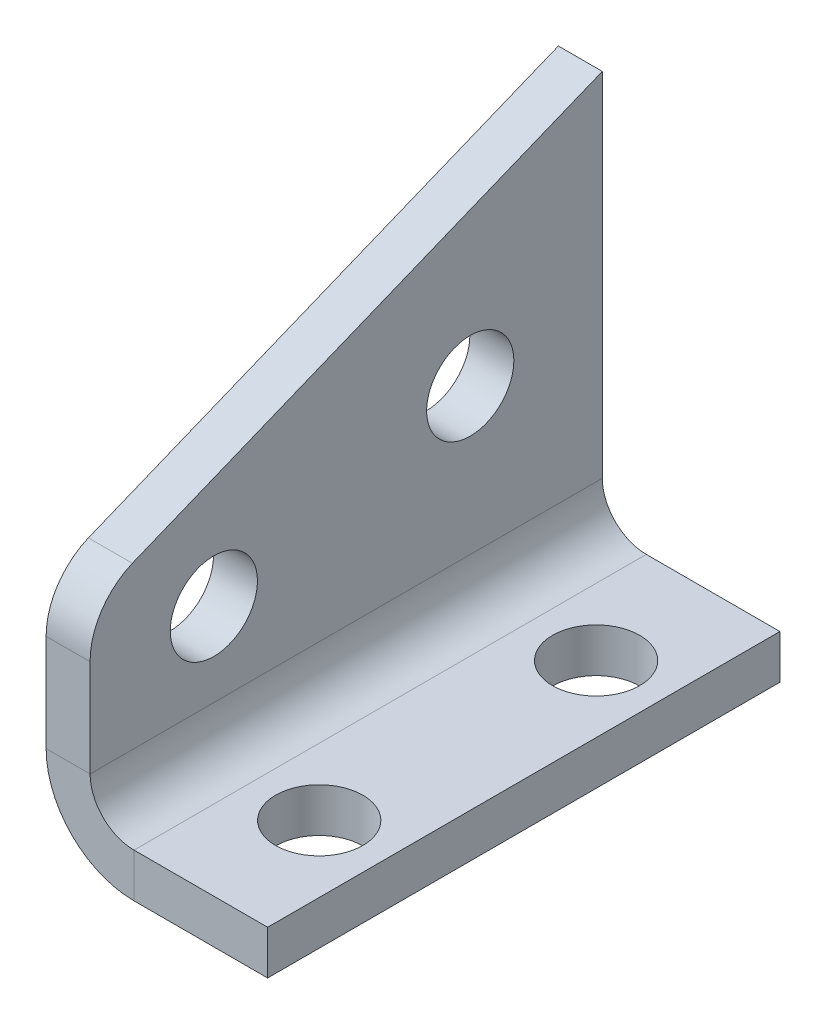
ISO-10303-21;
HEADER;
FILE_DESCRIPTION(('STEP AP214'),'2;1');
FILE_NAME('part.step','',(''),(''),'','','');
FILE_SCHEMA(('AUTOMOTIVE_DESIGN { 1 0 10303 214 1 1 1 1 }'));
ENDSEC;
DATA;
#1=APPLICATION_CONTEXT('core data for automotive mechanical design processes');
#2=APPLICATION_PROTOCOL_DEFINITION('international standard','automotive_design',2000,#1);
#3=PRODUCT_CONTEXT('',#1,'mechanical');
#4=PRODUCT('Part','Part','',(#3));
#5=PRODUCT_RELATED_PRODUCT_CATEGORY('part','',(#4));
#6=PRODUCT_DEFINITION_FORMATION('','',#4);
#7=PRODUCT_DEFINITION_CONTEXT('part definition',#1,'design');
#8=PRODUCT_DEFINITION('design','',#6,#7);
#9=PRODUCT_DEFINITION_SHAPE('','',#8);
#10=(LENGTH_UNIT() NAMED_UNIT(*) SI_UNIT(.MILLI.,.METRE.));
#11=(NAMED_UNIT(*) PLANE_ANGLE_UNIT() SI_UNIT($,.RADIAN.));
#12=(NAMED_UNIT(*) SI_UNIT($,.STERADIAN.) SOLID_ANGLE_UNIT());
#13=UNCERTAINTY_MEASURE_WITH_UNIT(LENGTH_MEASURE(1.E-05),#10,'distance_accuracy_value','');
#14=(GEOMETRIC_REPRESENTATION_CONTEXT(3) GLOBAL_UNCERTAINTY_ASSIGNED_CONTEXT((#13)) GLOBAL_UNIT_ASSIGNED_CONTEXT((#10,
#11,#12)) REPRESENTATION_CONTEXT('',''));
#15=CARTESIAN_POINT('',(0.,0.,0.));
#16=DIRECTION('',(0.,0.,1.));
#17=DIRECTION('',(1.,0.,0.));
#18=AXIS2_PLACEMENT_3D('',#15,#16,#17);
#19=CARTESIAN_POINT('',(-3.175,40.2912185861881,-48.5510647852261));
#20=DIRECTION('',(0.,0.,-1.));
#21=DIRECTION('',(-1.,0.,0.));
#22=AXIS2_PLACEMENT_3D('',#19,#20,#21);
#23=PLANE('',#22);
#24=DIRECTION('',(0.,1.,0.));
#25=VECTOR('',#24,1.);
#26=CARTESIAN_POINT('',(0.,40.2912185861881,-48.5510647852261));
#27=LINE('',#26,#25);
#28=CARTESIAN_POINT('',(0.,46.6412185861881,-48.5510647852261));
#29=VERTEX_POINT('',#28);
#30=CARTESIAN_POINT('',(0.,72.0930667513475,-48.5510647852261));
#31=VERTEX_POINT('',#30);
#32=EDGE_CURVE('E263',#29,#31,#27,.T.);
#33=ORIENTED_EDGE('',*,*,#32,.F.);
#34=DIRECTION('',(-1.,0.,0.));
#35=VECTOR('',#34,1.);
#36=CARTESIAN_POINT('',(0.,46.6412185861881,-48.5510647852261));
#37=LINE('',#36,#35);
#38=CARTESIAN_POINT('',(-3.175,46.6412185861881,-48.5510647852261));
#39=VERTEX_POINT('',#38);
#40=EDGE_CURVE('E211',#29,#39,#37,.T.);
#41=ORIENTED_EDGE('',*,*,#40,.T.);
#42=DIRECTION('',(0.,1.,0.));
#43=VECTOR('',#42,1.);
#44=CARTESIAN_POINT('',(-3.175,40.2912185861881,-48.5510647852261));
#45=LINE('',#44,#43);
#46=CARTESIAN_POINT('',(-3.175,72.0930667513475,-48.5510647852261));
#47=VERTEX_POINT('',#46);
#48=EDGE_CURVE('E113',#39,#47,#45,.T.);
#49=ORIENTED_EDGE('',*,*,#48,.T.);
#50=DIRECTION('',(1.,0.,0.));
#51=VECTOR('',#50,1.);
#52=CARTESIAN_POINT('',(-3.175,72.0930667513475,-48.5510647852261));
#53=LINE('',#52,#51);
#54=EDGE_CURVE('E71',#47,#31,#53,.T.);
#55=ORIENTED_EDGE('',*,*,#54,.T.);
#56=EDGE_LOOP('',(#33,#41,#49,#55));
#57=FACE_BOUND('',#56,.T.);
#58=ADVANCED_FACE('F67',(#57),#23,.T.);
#59=CARTESIAN_POINT('',(-3.175,53.6927819865224,-16.5509889828002));
#60=DIRECTION('',(1.,0.,0.));
#61=DIRECTION('',(0.,0.,-1.));
#62=AXIS2_PLACEMENT_3D('',#59,#60,#61);
#63=PLANE('',#62);
#64=CARTESIAN_POINT('',(-3.175,57.1947735785803,-39.0112205884761));
#65=DIRECTION('',(1.,0.,0.));
#66=DIRECTION('',(0.,0.,-1.));
#67=AXIS2_PLACEMENT_3D('',#64,#65,#66);
#68=CIRCLE('',#67,3.15);
#69=CARTESIAN_POINT('',(-3.175,57.1947735785803,-42.1612205884761));
#70=VERTEX_POINT('',#69);
#71=EDGE_CURVE('E240',#70,#70,#68,.T.);
#72=ORIENTED_EDGE('',*,*,#71,.T.);
#73=EDGE_LOOP('',(#72));
#74=FACE_BOUND('',#73,.T.);
#75=CARTESIAN_POINT('',(-3.175,52.6725231012808,-20.4902032658352));
#76=DIRECTION('',(1.,0.,0.));
#77=DIRECTION('',(0.,0.,-1.));
#78=AXIS2_PLACEMENT_3D('',#75,#76,#77);
#79=CIRCLE('',#78,3.15);
#80=CARTESIAN_POINT('',(-3.175,52.6725231012808,-23.6402032658352));
#81=VERTEX_POINT('',#80);
#82=EDGE_CURVE('E232',#81,#81,#79,.T.);
#83=ORIENTED_EDGE('',*,*,#82,.T.);
#84=EDGE_LOOP('',(#83));
#85=FACE_BOUND('',#84,.T.);
#86=DIRECTION('',(0.,0.,-1.));
#87=VECTOR('',#86,1.);
#88=CARTESIAN_POINT('',(-3.175,46.6412185861881,-48.5510647852261));
#89=LINE('',#88,#87);
#90=CARTESIAN_POINT('',(-3.175,46.6412185861881,-11.5510647852261));
#91=VERTEX_POINT('',#90);
#92=EDGE_CURVE('E203',#39,#91,#89,.F.);
#93=ORIENTED_EDGE('',*,*,#92,.T.);
#94=DIRECTION('',(0.,-1.,0.));
#95=VECTOR('',#94,1.);
#96=CARTESIAN_POINT('',(-3.175,53.6652498505171,-11.5510647852261));
#97=LINE('',#96,#95);
#98=CARTESIAN_POINT('',(-3.175,53.6652498505171,-11.5510647852261));
#99=VERTEX_POINT('',#98);
#100=EDGE_CURVE('E248',#99,#91,#97,.T.);
#101=ORIENTED_EDGE('',*,*,#100,.F.);
#102=CARTESIAN_POINT('',(-3.175,53.6927819865224,-16.5509889828002));
#103=DIRECTION('',(1.,0.,0.));
#104=DIRECTION('',(0.,0.,-1.));
#105=AXIS2_PLACEMENT_3D('',#102,#103,#104);
#106=CIRCLE('',#105,5.);
#107=CARTESIAN_POINT('',(-3.175,58.2975596939057,-14.6026506483251));
#108=VERTEX_POINT('',#107);
#109=EDGE_CURVE('E258',#108,#99,#106,.T.);
#110=ORIENTED_EDGE('',*,*,#109,.F.);
#111=DIRECTION('',(0.,-0.376469891536026,0.926428853591496));
#112=VECTOR('',#111,1.);
#113=CARTESIAN_POINT('',(-3.175,72.0930667513475,-48.5510647852261));
#114=LINE('',#113,#112);
#115=EDGE_CURVE('E254',#47,#108,#114,.T.);
#116=ORIENTED_EDGE('',*,*,#115,.F.);
#117=ORIENTED_EDGE('',*,*,#48,.F.);
#118=EDGE_LOOP('',(#93,#101,#110,#116,#117));
#119=FACE_BOUND('',#118,.T.);
#120=ADVANCED_FACE('F284',(#74,#85,#119),#63,.F.);
#121=CARTESIAN_POINT('',(0.,53.6927819865224,-16.5509889828002));
#122=DIRECTION('',(1.,0.,0.));
#123=DIRECTION('',(0.,0.,-1.));
#124=AXIS2_PLACEMENT_3D('',#121,#122,#123);
#125=PLANE('',#124);
#126=CARTESIAN_POINT('',(0.,52.6725231012808,-20.4902032658352));
#127=DIRECTION('',(1.,0.,0.));
#128=DIRECTION('',(0.,0.,-1.));
#129=AXIS2_PLACEMENT_3D('',#126,#127,#128);
#130=CIRCLE('',#129,3.15);
#131=CARTESIAN_POINT('',(0.,52.6725231012808,-23.6402032658352));
#132=VERTEX_POINT('',#131);
#133=EDGE_CURVE('E229',#132,#132,#130,.T.);
#134=ORIENTED_EDGE('',*,*,#133,.F.);
#135=EDGE_LOOP('',(#134));
#136=FACE_BOUND('',#135,.T.);
#137=CARTESIAN_POINT('',(0.,57.1947735785803,-39.0112205884761));
#138=DIRECTION('',(1.,0.,0.));
#139=DIRECTION('',(0.,0.,-1.));
#140=AXIS2_PLACEMENT_3D('',#137,#138,#139);
#141=CIRCLE('',#140,3.15);
#142=CARTESIAN_POINT('',(0.,57.1947735785803,-42.1612205884761));
#143=VERTEX_POINT('',#142);
#144=EDGE_CURVE('E236',#143,#143,#141,.T.);
#145=ORIENTED_EDGE('',*,*,#144,.F.);
#146=EDGE_LOOP('',(#145));
#147=FACE_BOUND('',#146,.T.);
#148=DIRECTION('',(0.,-1.,0.));
#149=VECTOR('',#148,1.);
#150=CARTESIAN_POINT('',(0.,53.6652498505171,-11.5510647852261));
#151=LINE('',#150,#149);
#152=CARTESIAN_POINT('',(0.,53.6652498505171,-11.5510647852261));
#153=VERTEX_POINT('',#152);
#154=CARTESIAN_POINT('',(0.,46.6412185861881,-11.5510647852261));
#155=VERTEX_POINT('',#154);
#156=EDGE_CURVE('E244',#153,#155,#151,.T.);
#157=ORIENTED_EDGE('',*,*,#156,.T.);
#158=DIRECTION('',(0.,0.,-1.));
#159=VECTOR('',#158,1.);
#160=CARTESIAN_POINT('',(0.,46.6412185861881,-48.5510647852261));
#161=LINE('',#160,#159);
#162=EDGE_CURVE('E85',#29,#155,#161,.F.);
#163=ORIENTED_EDGE('',*,*,#162,.F.);
#164=ORIENTED_EDGE('',*,*,#32,.T.);
#165=DIRECTION('',(0.,-0.376469891536026,0.926428853591496));
#166=VECTOR('',#165,1.);
#167=CARTESIAN_POINT('',(0.,72.0930667513475,-48.5510647852261));
#168=LINE('',#167,#166);
#169=CARTESIAN_POINT('',(0.,58.2975596939057,-14.6026506483251));
#170=VERTEX_POINT('',#169);
#171=EDGE_CURVE('E266',#31,#170,#168,.T.);
#172=ORIENTED_EDGE('',*,*,#171,.T.);
#173=CARTESIAN_POINT('',(0.,53.6927819865224,-16.5509889828002));
#174=DIRECTION('',(1.,0.,0.));
#175=DIRECTION('',(0.,0.,-1.));
#176=AXIS2_PLACEMENT_3D('',#173,#174,#175);
#177=CIRCLE('',#176,5.);
#178=EDGE_CURVE('E251',#170,#153,#177,.T.);
#179=ORIENTED_EDGE('',*,*,#178,.T.);
#180=EDGE_LOOP('',(#157,#163,#164,#172,#179));
#181=FACE_BOUND('',#180,.T.);
#182=ADVANCED_FACE('F280',(#136,#147,#181),#125,.T.);
#183=CARTESIAN_POINT('',(-3.175,53.6652498505171,-11.5510647852261));
#184=DIRECTION('',(0.,0.,1.));
#185=DIRECTION('',(0.,-1.,0.));
#186=AXIS2_PLACEMENT_3D('',#183,#184,#185);
#187=PLANE('',#186);
#188=DIRECTION('',(-1.,0.,0.));
#189=VECTOR('',#188,1.);
#190=CARTESIAN_POINT('',(0.,46.6412185861881,-11.5510647852261));
#191=LINE('',#190,#189);
#192=EDGE_CURVE('E225',#155,#91,#191,.T.);
#193=ORIENTED_EDGE('',*,*,#192,.F.);
#194=ORIENTED_EDGE('',*,*,#156,.F.);
#195=DIRECTION('',(1.,0.,0.));
#196=VECTOR('',#195,1.);
#197=CARTESIAN_POINT('',(-3.175,53.6652498505171,-11.5510647852261));
#198=LINE('',#197,#196);
#199=EDGE_CURVE('E13',#99,#153,#198,.T.);
#200=ORIENTED_EDGE('',*,*,#199,.F.);
#201=ORIENTED_EDGE('',*,*,#100,.T.);
#202=EDGE_LOOP('',(#193,#194,#200,#201));
#203=FACE_BOUND('',#202,.T.);
#204=ADVANCED_FACE('F69',(#203),#187,.T.);
#205=CARTESIAN_POINT('',(-3.175,53.6927819865224,-16.5509889828002));
#206=DIRECTION('',(1.,0.,0.));
#207=DIRECTION('',(0.,0.,-1.));
#208=AXIS2_PLACEMENT_3D('',#205,#206,#207);
#209=CYLINDRICAL_SURFACE('',#208,5.);
#210=ORIENTED_EDGE('',*,*,#178,.F.);
#211=DIRECTION('',(1.,0.,0.));
#212=VECTOR('',#211,1.);
#213=CARTESIAN_POINT('',(-3.175,58.2975596939057,-14.6026506483251));
#214=LINE('',#213,#212);
#215=EDGE_CURVE('E77',#108,#170,#214,.T.);
#216=ORIENTED_EDGE('',*,*,#215,.F.);
#217=ORIENTED_EDGE('',*,*,#109,.T.);
#218=ORIENTED_EDGE('',*,*,#199,.T.);
#219=EDGE_LOOP('',(#210,#216,#217,#218));
#220=FACE_BOUND('',#219,.T.);
#221=ADVANCED_FACE('F281',(#220),#209,.T.);
#222=CARTESIAN_POINT('',(-3.175,72.0930667513475,-48.5510647852261));
#223=DIRECTION('',(0.,0.926428853591496,0.376469891536026));
#224=DIRECTION('',(0.,-0.376469891536026,0.926428853591496));
#225=AXIS2_PLACEMENT_3D('',#222,#223,#224);
#226=PLANE('',#225);
#227=ORIENTED_EDGE('',*,*,#171,.F.);
#228=ORIENTED_EDGE('',*,*,#54,.F.);
#229=ORIENTED_EDGE('',*,*,#115,.T.);
#230=ORIENTED_EDGE('',*,*,#215,.T.);
#231=EDGE_LOOP('',(#227,#228,#229,#230));
#232=FACE_BOUND('',#231,.T.);
#233=ADVANCED_FACE('F279',(#232),#226,.T.);
#234=CARTESIAN_POINT('',(-3.175,57.1947735785803,-39.0112205884761));
#235=DIRECTION('',(1.,0.,0.));
#236=DIRECTION('',(0.,0.,-1.));
#237=AXIS2_PLACEMENT_3D('',#234,#235,#236);
#238=CYLINDRICAL_SURFACE('',#237,3.15);
#239=ORIENTED_EDGE('',*,*,#71,.F.);
#240=EDGE_LOOP('',(#239));
#241=FACE_BOUND('',#240,.T.);
#242=ORIENTED_EDGE('',*,*,#144,.T.);
#243=EDGE_LOOP('',(#242));
#244=FACE_BOUND('',#243,.T.);
#245=ADVANCED_FACE('F345',(#241,#244),#238,.F.);
#246=CARTESIAN_POINT('',(-3.175,52.6725231012808,-20.4902032658352));
#247=DIRECTION('',(1.,0.,0.));
#248=DIRECTION('',(0.,0.,-1.));
#249=AXIS2_PLACEMENT_3D('',#246,#247,#248);
#250=CYLINDRICAL_SURFACE('',#249,3.15);
#251=ORIENTED_EDGE('',*,*,#82,.F.);
#252=EDGE_LOOP('',(#251));
#253=FACE_BOUND('',#252,.T.);
#254=ORIENTED_EDGE('',*,*,#133,.T.);
#255=EDGE_LOOP('',(#254));
#256=FACE_BOUND('',#255,.T.);
#257=ADVANCED_FACE('F334',(#253,#256),#250,.F.);
#258=CARTESIAN_POINT('',(3.175,46.6412185861881,-11.5510647852261));
#259=DIRECTION('',(0.,0.,1.));
#260=DIRECTION('',(1.,0.,0.));
#261=AXIS2_PLACEMENT_3D('',#258,#259,#260);
#262=PLANE('',#261);
#263=DIRECTION('',(0.,1.,0.));
#264=VECTOR('',#263,1.);
#265=CARTESIAN_POINT('',(3.17499999999998,40.2912185861881,-11.5510647852261));
#266=LINE('',#265,#264);
#267=CARTESIAN_POINT('',(3.17499999999999,43.4662185861881,-11.5510647852261));
#268=VERTEX_POINT('',#267);
#269=CARTESIAN_POINT('',(3.17499999999998,40.2912185861881,-11.5510647852261));
#270=VERTEX_POINT('',#269);
#271=EDGE_CURVE('E175',#268,#270,#266,.F.);
#272=ORIENTED_EDGE('',*,*,#271,.F.);
#273=CARTESIAN_POINT('',(3.175,46.6412185861881,-11.5510647852261));
#274=DIRECTION('',(0.,0.,-1.));
#275=DIRECTION('',(-1.,0.,0.));
#276=AXIS2_PLACEMENT_3D('',#273,#274,#275);
#277=CIRCLE('',#276,3.175);
#278=EDGE_CURVE('E215',#155,#268,#277,.F.);
#279=ORIENTED_EDGE('',*,*,#278,.F.);
#280=ORIENTED_EDGE('',*,*,#192,.T.);
#281=CARTESIAN_POINT('',(3.175,46.6412185861881,-11.5510647852261));
#282=DIRECTION('',(0.,0.,-1.));
#283=DIRECTION('',(-1.,0.,0.));
#284=AXIS2_PLACEMENT_3D('',#281,#282,#283);
#285=CIRCLE('',#284,6.35);
#286=EDGE_CURVE('E206',#91,#270,#285,.F.);
#287=ORIENTED_EDGE('',*,*,#286,.T.);
#288=EDGE_LOOP('',(#272,#279,#280,#287));
#289=FACE_BOUND('',#288,.T.);
#290=ADVANCED_FACE('F289',(#289),#262,.T.);
#291=CARTESIAN_POINT('',(3.175,46.6412185861881,-48.5510647852261));
#292=DIRECTION('',(0.,0.,1.));
#293=DIRECTION('',(1.,0.,0.));
#294=AXIS2_PLACEMENT_3D('',#291,#292,#293);
#295=PLANE('',#294);
#296=CARTESIAN_POINT('',(3.175,46.6412185861881,-48.5510647852261));
#297=DIRECTION('',(0.,0.,-1.));
#298=DIRECTION('',(-1.,0.,0.));
#299=AXIS2_PLACEMENT_3D('',#296,#297,#298);
#300=CIRCLE('',#299,3.175);
#301=CARTESIAN_POINT('',(3.17499999999999,43.4662185861881,-48.5510647852261));
#302=VERTEX_POINT('',#301);
#303=EDGE_CURVE('E221',#302,#29,#300,.T.);
#304=ORIENTED_EDGE('',*,*,#303,.F.);
#305=DIRECTION('',(0.,1.,0.));
#306=VECTOR('',#305,1.);
#307=CARTESIAN_POINT('',(3.17499999999999,43.466218586188,-48.5510647852261));
#308=LINE('',#307,#306);
#309=CARTESIAN_POINT('',(3.17499999999998,40.2912185861881,-48.5510647852261));
#310=VERTEX_POINT('',#309);
#311=EDGE_CURVE('E193',#302,#310,#308,.F.);
#312=ORIENTED_EDGE('',*,*,#311,.T.);
#313=CARTESIAN_POINT('',(3.175,46.6412185861881,-48.5510647852261));
#314=DIRECTION('',(0.,0.,-1.));
#315=DIRECTION('',(-1.,0.,0.));
#316=AXIS2_PLACEMENT_3D('',#313,#314,#315);
#317=CIRCLE('',#316,6.35);
#318=EDGE_CURVE('E207',#310,#39,#317,.T.);
#319=ORIENTED_EDGE('',*,*,#318,.T.);
#320=ORIENTED_EDGE('',*,*,#40,.F.);
#321=EDGE_LOOP('',(#304,#312,#319,#320));
#322=FACE_BOUND('',#321,.T.);
#323=ADVANCED_FACE('F327',(#322),#295,.F.);
#324=CARTESIAN_POINT('',(3.175,46.6412185861881,-48.5510647852261));
#325=DIRECTION('',(0.,0.,-1.));
#326=DIRECTION('',(0.,-1.,0.));
#327=AXIS2_PLACEMENT_3D('',#324,#325,#326);
#328=CYLINDRICAL_SURFACE('',#327,6.35);
#329=ORIENTED_EDGE('',*,*,#92,.F.);
#330=ORIENTED_EDGE('',*,*,#318,.F.);
#331=DIRECTION('',(0.,0.,-1.));
#332=VECTOR('',#331,1.);
#333=CARTESIAN_POINT('',(3.17499999999998,40.2912185861881,-11.5510647852261));
#334=LINE('',#333,#332);
#335=EDGE_CURVE('E190',#310,#270,#334,.F.);
#336=ORIENTED_EDGE('',*,*,#335,.T.);
#337=ORIENTED_EDGE('',*,*,#286,.F.);
#338=EDGE_LOOP('',(#329,#330,#336,#337));
#339=FACE_BOUND('',#338,.T.);
#340=ADVANCED_FACE('F291',(#339),#328,.T.);
#341=CARTESIAN_POINT('',(3.175,46.6412185861881,-48.5510647852261));
#342=DIRECTION('',(0.,0.,-1.));
#343=DIRECTION('',(0.,-1.,0.));
#344=AXIS2_PLACEMENT_3D('',#341,#342,#343);
#345=CYLINDRICAL_SURFACE('',#344,3.175);
#346=ORIENTED_EDGE('',*,*,#162,.T.);
#347=ORIENTED_EDGE('',*,*,#278,.T.);
#348=DIRECTION('',(0.,0.,-1.));
#349=VECTOR('',#348,1.);
#350=CARTESIAN_POINT('',(3.17499999999999,43.4662185861881,-11.5510647852261));
#351=LINE('',#350,#349);
#352=EDGE_CURVE('E197',#268,#302,#351,.T.);
#353=ORIENTED_EDGE('',*,*,#352,.T.);
#354=ORIENTED_EDGE('',*,*,#303,.T.);
#355=EDGE_LOOP('',(#346,#347,#353,#354));
#356=FACE_BOUND('',#355,.T.);
#357=ADVANCED_FACE('F325',(#356),#345,.F.);
#358=CARTESIAN_POINT('',(0.,40.2912185861881,-11.5510647852261));
#359=DIRECTION('',(0.,0.,-1.));
#360=DIRECTION('',(-1.,0.,0.));
#361=AXIS2_PLACEMENT_3D('',#358,#359,#360);
#362=PLANE('',#361);
#363=ORIENTED_EDGE('',*,*,#271,.T.);
#364=DIRECTION('',(-1.,0.,0.));
#365=VECTOR('',#364,1.);
#366=CARTESIAN_POINT('',(1.19710565943884E-13,40.2912185861881,-11.5510647852261));
#367=LINE('',#366,#365);
#368=CARTESIAN_POINT('',(12.825,40.291218586188,-11.5510647852261));
#369=VERTEX_POINT('',#368);
#370=EDGE_CURVE('E154',#369,#270,#367,.T.);
#371=ORIENTED_EDGE('',*,*,#370,.F.);
#372=DIRECTION('',(0.,1.,0.));
#373=VECTOR('',#372,1.);
#374=CARTESIAN_POINT('',(12.825,40.291218586188,-11.5510647852261));
#375=LINE('',#374,#373);
#376=CARTESIAN_POINT('',(12.825,43.466218586188,-11.5510647852261));
#377=VERTEX_POINT('',#376);
#378=EDGE_CURVE('E161',#369,#377,#375,.T.);
#379=ORIENTED_EDGE('',*,*,#378,.T.);
#380=DIRECTION('',(1.,0.,0.));
#381=VECTOR('',#380,1.);
#382=CARTESIAN_POINT('',(0.,43.4662185861881,-11.5510647852261));
#383=LINE('',#382,#381);
#384=EDGE_CURVE('E187',#377,#268,#383,.F.);
#385=ORIENTED_EDGE('',*,*,#384,.T.);
#386=EDGE_LOOP('',(#363,#371,#379,#385));
#387=FACE_BOUND('',#386,.T.);
#388=ADVANCED_FACE('F174',(#387),#362,.F.);
#389=CARTESIAN_POINT('',(12.825,40.291218586188,-48.5510647852261));
#390=DIRECTION('',(0.,0.,1.));
#391=DIRECTION('',(1.,0.,0.));
#392=AXIS2_PLACEMENT_3D('',#389,#390,#391);
#393=PLANE('',#392);
#394=ORIENTED_EDGE('',*,*,#311,.F.);
#395=DIRECTION('',(-1.,0.,0.));
#396=VECTOR('',#395,1.);
#397=CARTESIAN_POINT('',(12.825,43.466218586188,-48.5510647852261));
#398=LINE('',#397,#396);
#399=CARTESIAN_POINT('',(12.825,43.466218586188,-48.5510647852261));
#400=VERTEX_POINT('',#399);
#401=EDGE_CURVE('E182',#302,#400,#398,.F.);
#402=ORIENTED_EDGE('',*,*,#401,.T.);
#403=DIRECTION('',(0.,1.,0.));
#404=VECTOR('',#403,1.);
#405=CARTESIAN_POINT('',(12.825,40.291218586188,-48.5510647852261));
#406=LINE('',#405,#404);
#407=CARTESIAN_POINT('',(12.825,40.291218586188,-48.5510647852261));
#408=VERTEX_POINT('',#407);
#409=EDGE_CURVE('E171',#408,#400,#406,.T.);
#410=ORIENTED_EDGE('',*,*,#409,.F.);
#411=DIRECTION('',(1.,0.,0.));
#412=VECTOR('',#411,1.);
#413=CARTESIAN_POINT('',(1.19710565943884E-13,40.2912185861881,-48.5510647852261));
#414=LINE('',#413,#412);
#415=EDGE_CURVE('E156',#310,#408,#414,.T.);
#416=ORIENTED_EDGE('',*,*,#415,.F.);
#417=EDGE_LOOP('',(#394,#402,#410,#416));
#418=FACE_BOUND('',#417,.T.);
#419=ADVANCED_FACE('F294',(#418),#393,.F.);
#420=CARTESIAN_POINT('',(1.19710565943884E-13,40.2912185861881,0.));
#421=DIRECTION('',(0.,1.,0.));
#422=DIRECTION('',(-1.,0.,0.));
#423=AXIS2_PLACEMENT_3D('',#420,#421,#422);
#424=PLANE('',#423);
#425=CARTESIAN_POINT('',(7.99999999999998,40.291218586188,-40.1023008306411));
#426=DIRECTION('',(0.,1.,0.));
#427=DIRECTION('',(-1.,0.,0.));
#428=AXIS2_PLACEMENT_3D('',#425,#426,#427);
#429=CIRCLE('',#428,3.15);
#430=CARTESIAN_POINT('',(4.84999999999999,40.291218586188,-40.1023008306411));
#431=VERTEX_POINT('',#430);
#432=EDGE_CURVE('E202',#431,#431,#429,.T.);
#433=ORIENTED_EDGE('',*,*,#432,.T.);
#434=EDGE_LOOP('',(#433));
#435=FACE_BOUND('',#434,.T.);
#436=CARTESIAN_POINT('',(7.99999999999998,40.291218586188,-20.1023008306411));
#437=DIRECTION('',(0.,1.,0.));
#438=DIRECTION('',(-1.,0.,0.));
#439=AXIS2_PLACEMENT_3D('',#436,#437,#438);
#440=CIRCLE('',#439,3.15);
#441=CARTESIAN_POINT('',(4.84999999999998,40.291218586188,-20.1023008306411));
#442=VERTEX_POINT('',#441);
#443=EDGE_CURVE('E301',#442,#442,#440,.T.);
#444=ORIENTED_EDGE('',*,*,#443,.T.);
#445=EDGE_LOOP('',(#444));
#446=FACE_BOUND('',#445,.T.);
#447=ORIENTED_EDGE('',*,*,#335,.F.);
#448=ORIENTED_EDGE('',*,*,#415,.T.);
#449=DIRECTION('',(0.,0.,1.));
#450=VECTOR('',#449,1.);
#451=CARTESIAN_POINT('',(12.825,40.291218586188,0.));
#452=LINE('',#451,#450);
#453=EDGE_CURVE('E149',#408,#369,#452,.T.);
#454=ORIENTED_EDGE('',*,*,#453,.T.);
#455=ORIENTED_EDGE('',*,*,#370,.T.);
#456=EDGE_LOOP('',(#447,#448,#454,#455));
#457=FACE_BOUND('',#456,.T.);
#458=ADVANCED_FACE('F152',(#435,#446,#457),#424,.F.);
#459=CARTESIAN_POINT('',(1.30796019194711E-13,43.4662185861881,0.));
#460=DIRECTION('',(0.,1.,0.));
#461=DIRECTION('',(-1.,0.,0.));
#462=AXIS2_PLACEMENT_3D('',#459,#460,#461);
#463=PLANE('',#462);
#464=CARTESIAN_POINT('',(7.99999999999999,43.466218586188,-40.1023008306411));
#465=DIRECTION('',(0.,1.,0.));
#466=DIRECTION('',(-1.,0.,0.));
#467=AXIS2_PLACEMENT_3D('',#464,#465,#466);
#468=CIRCLE('',#467,3.15);
#469=CARTESIAN_POINT('',(4.85,43.466218586188,-40.1023008306411));
#470=VERTEX_POINT('',#469);
#471=EDGE_CURVE('E305',#470,#470,#468,.T.);
#472=ORIENTED_EDGE('',*,*,#471,.F.);
#473=EDGE_LOOP('',(#472));
#474=FACE_BOUND('',#473,.T.);
#475=CARTESIAN_POINT('',(7.99999999999999,43.466218586188,-20.1023008306411));
#476=DIRECTION('',(0.,1.,0.));
#477=DIRECTION('',(-1.,0.,0.));
#478=AXIS2_PLACEMENT_3D('',#475,#476,#477);
#479=CIRCLE('',#478,3.15);
#480=CARTESIAN_POINT('',(4.84999999999999,43.466218586188,-20.1023008306411));
#481=VERTEX_POINT('',#480);
#482=EDGE_CURVE('E306',#481,#481,#479,.T.);
#483=ORIENTED_EDGE('',*,*,#482,.F.);
#484=EDGE_LOOP('',(#483));
#485=FACE_BOUND('',#484,.T.);
#486=ORIENTED_EDGE('',*,*,#401,.F.);
#487=ORIENTED_EDGE('',*,*,#352,.F.);
#488=ORIENTED_EDGE('',*,*,#384,.F.);
#489=DIRECTION('',(0.,0.,-1.));
#490=VECTOR('',#489,1.);
#491=CARTESIAN_POINT('',(12.825,43.466218586188,-11.5510647852261));
#492=LINE('',#491,#490);
#493=EDGE_CURVE('E166',#400,#377,#492,.F.);
#494=ORIENTED_EDGE('',*,*,#493,.F.);
#495=EDGE_LOOP('',(#486,#487,#488,#494));
#496=FACE_BOUND('',#495,.T.);
#497=ADVANCED_FACE('F316',(#474,#485,#496),#463,.T.);
#498=CARTESIAN_POINT('',(12.825,40.291218586188,-11.5510647852261));
#499=DIRECTION('',(-1.,0.,0.));
#500=DIRECTION('',(0.,-1.,0.));
#501=AXIS2_PLACEMENT_3D('',#498,#499,#500);
#502=PLANE('',#501);
#503=ORIENTED_EDGE('',*,*,#493,.T.);
#504=ORIENTED_EDGE('',*,*,#378,.F.);
#505=ORIENTED_EDGE('',*,*,#453,.F.);
#506=ORIENTED_EDGE('',*,*,#409,.T.);
#507=EDGE_LOOP('',(#503,#504,#505,#506));
#508=FACE_BOUND('',#507,.T.);
#509=ADVANCED_FACE('F164',(#508),#502,.F.);
#510=CARTESIAN_POINT('',(7.99999999999996,33.466218586188,-20.1023008306411));
#511=DIRECTION('',(0.,1.,0.));
#512=DIRECTION('',(-1.,0.,0.));
#513=AXIS2_PLACEMENT_3D('',#510,#511,#512);
#514=CYLINDRICAL_SURFACE('',#513,3.15);
#515=ORIENTED_EDGE('',*,*,#482,.T.);
#516=EDGE_LOOP('',(#515));
#517=FACE_BOUND('',#516,.T.);
#518=ORIENTED_EDGE('',*,*,#443,.F.);
#519=EDGE_LOOP('',(#518));
#520=FACE_BOUND('',#519,.T.);
#521=ADVANCED_FACE('F420',(#517,#520),#514,.F.);
#522=CARTESIAN_POINT('',(7.99999999999996,33.466218586188,-40.1023008306411));
#523=DIRECTION('',(0.,1.,0.));
#524=DIRECTION('',(-1.,0.,0.));
#525=AXIS2_PLACEMENT_3D('',#522,#523,#524);
#526=CYLINDRICAL_SURFACE('',#525,3.15);
#527=ORIENTED_EDGE('',*,*,#471,.T.);
#528=EDGE_LOOP('',(#527));
#529=FACE_BOUND('',#528,.T.);
#530=ORIENTED_EDGE('',*,*,#432,.F.);
#531=EDGE_LOOP('',(#530));
#532=FACE_BOUND('',#531,.T.);
#533=ADVANCED_FACE('F313',(#529,#532),#526,.F.);
#534=CLOSED_SHELL('',(#58,#120,#182,#204,#221,#233,#245,#257,#290,#323,#340,#357,#388,#419,#458,
#497,#509,#521,#533));
#535=MANIFOLD_SOLID_BREP('B2',#534);
#536=ADVANCED_BREP_SHAPE_REPRESENTATION('',(#18,#535),#14);
#537=SHAPE_DEFINITION_REPRESENTATION(#9,#536);
ENDSEC;
END-ISO-10303-21;
